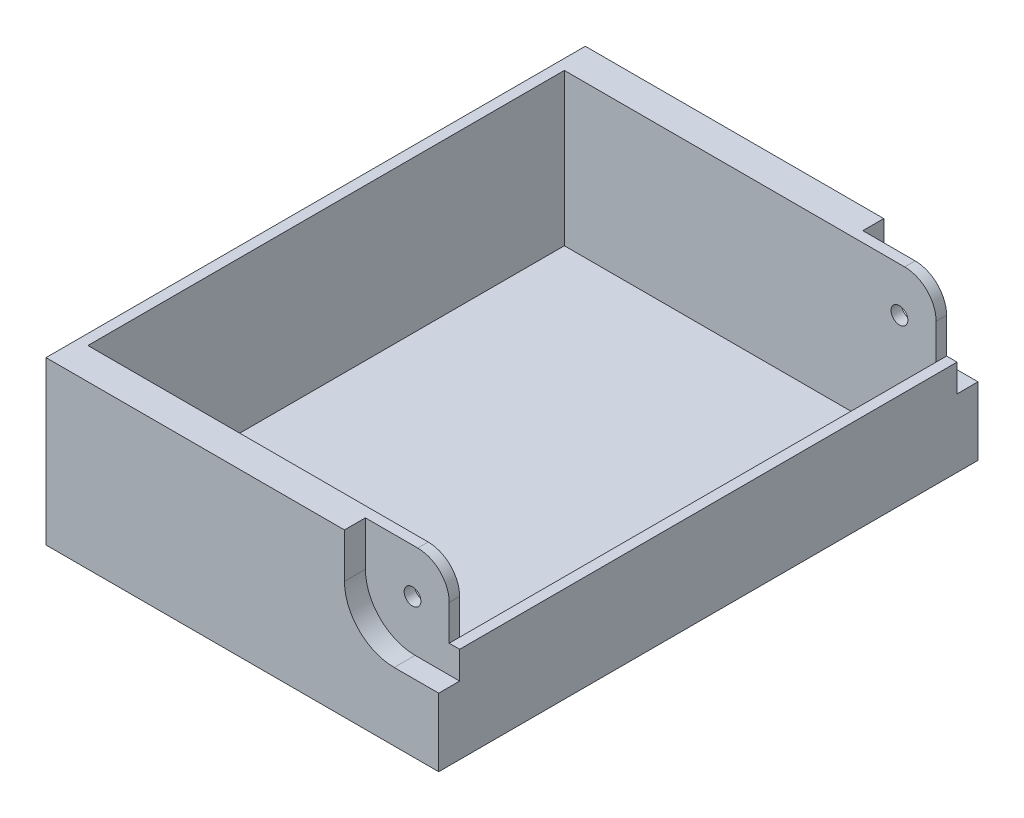
ISO-10303-21;
HEADER;
FILE_DESCRIPTION(('STEP AP214'),'2;1');
FILE_NAME('part.step','',(''),(''),'','','');
FILE_SCHEMA(('AUTOMOTIVE_DESIGN { 1 0 10303 214 1 1 1 1 }'));
ENDSEC;
DATA;
#1=APPLICATION_CONTEXT('core data for automotive mechanical design processes');
#2=APPLICATION_PROTOCOL_DEFINITION('international standard','automotive_design',2000,#1);
#3=PRODUCT_CONTEXT('',#1,'mechanical');
#4=PRODUCT('Part','Part','',(#3));
#5=PRODUCT_RELATED_PRODUCT_CATEGORY('part','',(#4));
#6=PRODUCT_DEFINITION_FORMATION('','',#4);
#7=PRODUCT_DEFINITION_CONTEXT('part definition',#1,'design');
#8=PRODUCT_DEFINITION('design','',#6,#7);
#9=PRODUCT_DEFINITION_SHAPE('','',#8);
#10=(LENGTH_UNIT() NAMED_UNIT(*) SI_UNIT(.MILLI.,.METRE.));
#11=(NAMED_UNIT(*) PLANE_ANGLE_UNIT() SI_UNIT($,.RADIAN.));
#12=(NAMED_UNIT(*) SI_UNIT($,.STERADIAN.) SOLID_ANGLE_UNIT());
#13=UNCERTAINTY_MEASURE_WITH_UNIT(LENGTH_MEASURE(1.E-05),#10,'distance_accuracy_value','');
#14=(GEOMETRIC_REPRESENTATION_CONTEXT(3) GLOBAL_UNCERTAINTY_ASSIGNED_CONTEXT((#13)) GLOBAL_UNIT_ASSIGNED_CONTEXT((#10,
#11,#12)) REPRESENTATION_CONTEXT('',''));
#15=CARTESIAN_POINT('',(0.,0.,0.));
#16=DIRECTION('',(0.,0.,1.));
#17=DIRECTION('',(1.,0.,0.));
#18=AXIS2_PLACEMENT_3D('',#15,#16,#17);
#19=CARTESIAN_POINT('',(-59.1666666666667,25.,51.2002398081536));
#20=DIRECTION('',(0.,0.,-1.));
#21=DIRECTION('',(-1.,0.,0.));
#22=AXIS2_PLACEMENT_3D('',#19,#20,#21);
#23=PLANE('',#22);
#24=CARTESIAN_POINT('',(6.83333333333334,16.5,51.2002398081536));
#25=DIRECTION('',(0.,0.,-1.));
#26=DIRECTION('',(-1.,0.,0.));
#27=AXIS2_PLACEMENT_3D('',#24,#25,#26);
#28=CIRCLE('',#27,1.6);
#29=CARTESIAN_POINT('',(5.23333333333334,16.5,51.2002398081536));
#30=VERTEX_POINT('',#29);
#31=EDGE_CURVE('E323',#30,#30,#28,.T.);
#32=ORIENTED_EDGE('',*,*,#31,.F.);
#33=EDGE_LOOP('',(#32));
#34=FACE_BOUND('',#33,.T.);
#35=CARTESIAN_POINT('',(7.83333333333333,19.,51.2002398081536));
#36=DIRECTION('',(0.,0.,-1.));
#37=DIRECTION('',(-1.,0.,0.));
#38=AXIS2_PLACEMENT_3D('',#35,#36,#37);
#39=CIRCLE('',#38,6.);
#40=CARTESIAN_POINT('',(13.8333333333333,19.,51.2002398081536));
#41=VERTEX_POINT('',#40);
#42=CARTESIAN_POINT('',(7.83333333333329,25.,51.2002398081536));
#43=VERTEX_POINT('',#42);
#44=EDGE_CURVE('E250',#41,#43,#39,.F.);
#45=ORIENTED_EDGE('',*,*,#44,.F.);
#46=DIRECTION('',(0.,-1.,0.));
#47=VECTOR('',#46,1.);
#48=CARTESIAN_POINT('',(13.8333333333333,25.,51.2002398081536));
#49=LINE('',#48,#47);
#50=CARTESIAN_POINT('',(13.8333333333333,12.2573593128807,51.2002398081536));
#51=VERTEX_POINT('',#50);
#52=EDGE_CURVE('E196',#41,#51,#49,.T.);
#53=ORIENTED_EDGE('',*,*,#52,.T.);
#54=CARTESIAN_POINT('',(13.8333333333333,-4.,51.2002398081536));
#55=VERTEX_POINT('',#54);
#56=EDGE_CURVE('E202',#51,#55,#49,.T.);
#57=ORIENTED_EDGE('',*,*,#56,.T.);
#58=DIRECTION('',(1.,0.,0.));
#59=VECTOR('',#58,1.);
#60=CARTESIAN_POINT('',(-57.1666666666667,-4.,51.2002398081536));
#61=LINE('',#60,#59);
#62=CARTESIAN_POINT('',(-57.1666666666667,-4.,51.2002398081536));
#63=VERTEX_POINT('',#62);
#64=EDGE_CURVE('E199',#63,#55,#61,.T.);
#65=ORIENTED_EDGE('',*,*,#64,.F.);
#66=DIRECTION('',(0.,-1.,0.));
#67=VECTOR('',#66,1.);
#68=CARTESIAN_POINT('',(-57.1666666666667,25.,51.2002398081536));
#69=LINE('',#68,#67);
#70=CARTESIAN_POINT('',(-57.1666666666667,25.,51.2002398081536));
#71=VERTEX_POINT('',#70);
#72=EDGE_CURVE('E182',#71,#63,#69,.T.);
#73=ORIENTED_EDGE('',*,*,#72,.F.);
#74=DIRECTION('',(1.,0.,0.));
#75=VECTOR('',#74,1.);
#76=CARTESIAN_POINT('',(-59.1666666666667,25.,51.2002398081536));
#77=LINE('',#76,#75);
#78=EDGE_CURVE('E396',#71,#43,#77,.T.);
#79=ORIENTED_EDGE('',*,*,#78,.T.);
#80=EDGE_LOOP('',(#45,#53,#57,#65,#73,#79));
#81=FACE_BOUND('',#80,.T.);
#82=ADVANCED_FACE('F39',(#34,#81),#23,.T.);
#83=CARTESIAN_POINT('',(-59.1666666666667,25.,-39.7997601918464));
#84=DIRECTION('',(0.,0.,1.));
#85=DIRECTION('',(1.,0.,0.));
#86=AXIS2_PLACEMENT_3D('',#83,#84,#85);
#87=PLANE('',#86);
#88=CARTESIAN_POINT('',(6.83333333333334,16.5,-39.7997601918464));
#89=DIRECTION('',(0.,0.,1.));
#90=DIRECTION('',(1.,0.,0.));
#91=AXIS2_PLACEMENT_3D('',#88,#89,#90);
#92=CIRCLE('',#91,1.6);
#93=CARTESIAN_POINT('',(8.43333333333334,16.5,-39.7997601918464));
#94=VERTEX_POINT('',#93);
#95=EDGE_CURVE('E319',#94,#94,#92,.T.);
#96=ORIENTED_EDGE('',*,*,#95,.F.);
#97=EDGE_LOOP('',(#96));
#98=FACE_BOUND('',#97,.T.);
#99=CARTESIAN_POINT('',(7.83333333333333,19.,-39.7997601918464));
#100=DIRECTION('',(0.,0.,1.));
#101=DIRECTION('',(1.,0.,0.));
#102=AXIS2_PLACEMENT_3D('',#99,#100,#101);
#103=CIRCLE('',#102,6.);
#104=CARTESIAN_POINT('',(7.83333333333329,25.,-39.7997601918464));
#105=VERTEX_POINT('',#104);
#106=CARTESIAN_POINT('',(13.8333333333333,19.,-39.7997601918464));
#107=VERTEX_POINT('',#106);
#108=EDGE_CURVE('E63',#105,#107,#103,.F.);
#109=ORIENTED_EDGE('',*,*,#108,.F.);
#110=DIRECTION('',(-1.,0.,0.));
#111=VECTOR('',#110,1.);
#112=CARTESIAN_POINT('',(-59.1666666666667,25.,-39.7997601918464));
#113=LINE('',#112,#111);
#114=CARTESIAN_POINT('',(-57.1666666666667,25.,-39.7997601918464));
#115=VERTEX_POINT('',#114);
#116=EDGE_CURVE('E388',#105,#115,#113,.T.);
#117=ORIENTED_EDGE('',*,*,#116,.T.);
#118=DIRECTION('',(0.,-1.,0.));
#119=VECTOR('',#118,1.);
#120=CARTESIAN_POINT('',(-57.1666666666667,25.,-39.7997601918464));
#121=LINE('',#120,#119);
#122=CARTESIAN_POINT('',(-57.1666666666667,-4.,-39.7997601918464));
#123=VERTEX_POINT('',#122);
#124=EDGE_CURVE('E384',#115,#123,#121,.T.);
#125=ORIENTED_EDGE('',*,*,#124,.T.);
#126=DIRECTION('',(-1.,0.,0.));
#127=VECTOR('',#126,1.);
#128=CARTESIAN_POINT('',(-57.1666666666667,-4.,-39.7997601918464));
#129=LINE('',#128,#127);
#130=CARTESIAN_POINT('',(13.8333333333333,-4.,-39.7997601918464));
#131=VERTEX_POINT('',#130);
#132=EDGE_CURVE('E211',#131,#123,#129,.T.);
#133=ORIENTED_EDGE('',*,*,#132,.F.);
#134=DIRECTION('',(0.,-1.,0.));
#135=VECTOR('',#134,1.);
#136=CARTESIAN_POINT('',(13.8333333333333,25.,-39.7997601918464));
#137=LINE('',#136,#135);
#138=CARTESIAN_POINT('',(13.8333333333333,12.2573593128807,-39.7997601918464));
#139=VERTEX_POINT('',#138);
#140=EDGE_CURVE('E387',#139,#131,#137,.T.);
#141=ORIENTED_EDGE('',*,*,#140,.F.);
#142=EDGE_CURVE('E391',#107,#139,#137,.T.);
#143=ORIENTED_EDGE('',*,*,#142,.F.);
#144=EDGE_LOOP('',(#109,#117,#125,#133,#141,#143));
#145=FACE_BOUND('',#144,.T.);
#146=ADVANCED_FACE('F461',(#98,#145),#87,.T.);
#147=CARTESIAN_POINT('',(7.33333333333333,16.5,-41.7997601918464));
#148=DIRECTION('',(0.,0.,-1.));
#149=DIRECTION('',(-1.,0.,0.));
#150=AXIS2_PLACEMENT_3D('',#147,#148,#149);
#151=PLANE('',#150);
#152=CARTESIAN_POINT('',(6.83333333333334,16.5,-41.7997601918464));
#153=DIRECTION('',(0.,0.,-1.));
#154=DIRECTION('',(-1.,0.,0.));
#155=AXIS2_PLACEMENT_3D('',#152,#153,#154);
#156=CIRCLE('',#155,1.6);
#157=CARTESIAN_POINT('',(5.23333333333334,16.5,-41.7997601918464));
#158=VERTEX_POINT('',#157);
#159=EDGE_CURVE('E315',#158,#158,#156,.T.);
#160=ORIENTED_EDGE('',*,*,#159,.F.);
#161=EDGE_LOOP('',(#160));
#162=FACE_BOUND('',#161,.T.);
#163=CARTESIAN_POINT('',(7.83333333333333,19.,-41.7997601918464));
#164=DIRECTION('',(0.,0.,-1.));
#165=DIRECTION('',(-1.,0.,0.));
#166=AXIS2_PLACEMENT_3D('',#163,#164,#165);
#167=CIRCLE('',#166,6.);
#168=CARTESIAN_POINT('',(13.8333333333333,19.,-41.7997601918464));
#169=VERTEX_POINT('',#168);
#170=CARTESIAN_POINT('',(7.83333333333329,25.,-41.7997601918464));
#171=VERTEX_POINT('',#170);
#172=EDGE_CURVE('E235',#169,#171,#167,.F.);
#173=ORIENTED_EDGE('',*,*,#172,.F.);
#174=DIRECTION('',(0.,1.,0.));
#175=VECTOR('',#174,1.);
#176=CARTESIAN_POINT('',(13.8333333333333,25.,-41.7997601918464));
#177=LINE('',#176,#175);
#178=CARTESIAN_POINT('',(13.8333333333333,12.2573593128807,-41.7997601918464));
#179=VERTEX_POINT('',#178);
#180=EDGE_CURVE('E295',#179,#169,#177,.T.);
#181=ORIENTED_EDGE('',*,*,#180,.F.);
#182=DIRECTION('',(1.,0.,0.));
#183=VECTOR('',#182,1.);
#184=CARTESIAN_POINT('',(13.8333333333333,12.2573593128807,-41.7997601918464));
#185=LINE('',#184,#183);
#186=CARTESIAN_POINT('',(15.8333333333333,12.2573593128807,-41.7997601918464));
#187=VERTEX_POINT('',#186);
#188=EDGE_CURVE('E304',#179,#187,#185,.T.);
#189=ORIENTED_EDGE('',*,*,#188,.T.);
#190=DIRECTION('',(0.,-1.,0.));
#191=VECTOR('',#190,1.);
#192=CARTESIAN_POINT('',(15.8333333333333,7.,-41.7997601918464));
#193=LINE('',#192,#191);
#194=CARTESIAN_POINT('',(15.8333333333333,7.,-41.7997601918464));
#195=VERTEX_POINT('',#194);
#196=EDGE_CURVE('E271',#187,#195,#193,.T.);
#197=ORIENTED_EDGE('',*,*,#196,.T.);
#198=DIRECTION('',(-1.,0.,0.));
#199=VECTOR('',#198,1.);
#200=CARTESIAN_POINT('',(7.33333333333323,7.,-41.7997601918464));
#201=LINE('',#200,#199);
#202=CARTESIAN_POINT('',(7.33333333333333,7.,-41.7997601918464));
#203=VERTEX_POINT('',#202);
#204=EDGE_CURVE('E274',#195,#203,#201,.T.);
#205=ORIENTED_EDGE('',*,*,#204,.T.);
#206=CARTESIAN_POINT('',(7.33333333333333,16.5,-41.7997601918464));
#207=DIRECTION('',(0.,0.,-1.));
#208=DIRECTION('',(-1.,0.,0.));
#209=AXIS2_PLACEMENT_3D('',#206,#207,#208);
#210=CIRCLE('',#209,9.5);
#211=CARTESIAN_POINT('',(-2.16666666666667,16.5,-41.7997601918464));
#212=VERTEX_POINT('',#211);
#213=EDGE_CURVE('E346',#203,#212,#210,.T.);
#214=ORIENTED_EDGE('',*,*,#213,.T.);
#215=DIRECTION('',(0.,1.,0.));
#216=VECTOR('',#215,1.);
#217=CARTESIAN_POINT('',(-2.16666666666668,26.,-41.7997601918464));
#218=LINE('',#217,#216);
#219=CARTESIAN_POINT('',(-2.16666666666668,25.,-41.7997601918464));
#220=VERTEX_POINT('',#219);
#221=EDGE_CURVE('E349',#212,#220,#218,.T.);
#222=ORIENTED_EDGE('',*,*,#221,.T.);
#223=DIRECTION('',(-1.,0.,0.));
#224=VECTOR('',#223,1.);
#225=CARTESIAN_POINT('',(0.,25.,-41.7997601918464));
#226=LINE('',#225,#224);
#227=EDGE_CURVE('E407',#171,#220,#226,.T.);
#228=ORIENTED_EDGE('',*,*,#227,.F.);
#229=EDGE_LOOP('',(#173,#181,#189,#197,#205,#214,#222,#228));
#230=FACE_BOUND('',#229,.T.);
#231=ADVANCED_FACE('F447',(#162,#230),#151,.T.);
#232=CARTESIAN_POINT('',(7.33333333333334,16.5,53.2002398081536));
#233=DIRECTION('',(0.,0.,1.));
#234=DIRECTION('',(1.,0.,0.));
#235=AXIS2_PLACEMENT_3D('',#232,#233,#234);
#236=PLANE('',#235);
#237=CARTESIAN_POINT('',(6.83333333333334,16.5,53.2002398081536));
#238=DIRECTION('',(0.,0.,1.));
#239=DIRECTION('',(1.,0.,0.));
#240=AXIS2_PLACEMENT_3D('',#237,#238,#239);
#241=CIRCLE('',#240,1.6);
#242=CARTESIAN_POINT('',(8.43333333333334,16.5,53.2002398081536));
#243=VERTEX_POINT('',#242);
#244=EDGE_CURVE('E308',#243,#243,#241,.T.);
#245=ORIENTED_EDGE('',*,*,#244,.F.);
#246=EDGE_LOOP('',(#245));
#247=FACE_BOUND('',#246,.T.);
#248=CARTESIAN_POINT('',(7.83333333333333,19.,53.2002398081536));
#249=DIRECTION('',(0.,0.,1.));
#250=DIRECTION('',(1.,0.,0.));
#251=AXIS2_PLACEMENT_3D('',#248,#249,#250);
#252=CIRCLE('',#251,6.);
#253=CARTESIAN_POINT('',(7.83333333333329,25.,53.2002398081536));
#254=VERTEX_POINT('',#253);
#255=CARTESIAN_POINT('',(13.8333333333333,19.,53.2002398081536));
#256=VERTEX_POINT('',#255);
#257=EDGE_CURVE('E55',#254,#256,#252,.F.);
#258=ORIENTED_EDGE('',*,*,#257,.F.);
#259=DIRECTION('',(1.,0.,0.));
#260=VECTOR('',#259,1.);
#261=CARTESIAN_POINT('',(0.,25.,53.2002398081536));
#262=LINE('',#261,#260);
#263=CARTESIAN_POINT('',(-2.16666666666666,25.,53.2002398081536));
#264=VERTEX_POINT('',#263);
#265=EDGE_CURVE('E48',#264,#254,#262,.T.);
#266=ORIENTED_EDGE('',*,*,#265,.F.);
#267=DIRECTION('',(0.,-1.,0.));
#268=VECTOR('',#267,1.);
#269=CARTESIAN_POINT('',(-2.16666666666666,26.,53.2002398081536));
#270=LINE('',#269,#268);
#271=CARTESIAN_POINT('',(-2.16666666666666,16.5,53.2002398081536));
#272=VERTEX_POINT('',#271);
#273=EDGE_CURVE('E328',#264,#272,#270,.T.);
#274=ORIENTED_EDGE('',*,*,#273,.T.);
#275=CARTESIAN_POINT('',(7.33333333333334,16.5,53.2002398081536));
#276=DIRECTION('',(0.,0.,1.));
#277=DIRECTION('',(1.,0.,0.));
#278=AXIS2_PLACEMENT_3D('',#275,#276,#277);
#279=CIRCLE('',#278,9.5);
#280=CARTESIAN_POINT('',(7.33333333333344,7.,53.2002398081536));
#281=VERTEX_POINT('',#280);
#282=EDGE_CURVE('E331',#272,#281,#279,.T.);
#283=ORIENTED_EDGE('',*,*,#282,.T.);
#284=DIRECTION('',(1.,0.,0.));
#285=VECTOR('',#284,1.);
#286=CARTESIAN_POINT('',(7.33333333333344,7.,53.2002398081536));
#287=LINE('',#286,#285);
#288=CARTESIAN_POINT('',(15.8333333333333,7.,53.2002398081536));
#289=VERTEX_POINT('',#288);
#290=EDGE_CURVE('E254',#281,#289,#287,.T.);
#291=ORIENTED_EDGE('',*,*,#290,.T.);
#292=DIRECTION('',(0.,1.,0.));
#293=VECTOR('',#292,1.);
#294=CARTESIAN_POINT('',(15.8333333333333,7.,53.2002398081536));
#295=LINE('',#294,#293);
#296=CARTESIAN_POINT('',(15.8333333333333,12.2573593128807,53.2002398081536));
#297=VERTEX_POINT('',#296);
#298=EDGE_CURVE('E258',#289,#297,#295,.T.);
#299=ORIENTED_EDGE('',*,*,#298,.T.);
#300=DIRECTION('',(1.,0.,0.));
#301=VECTOR('',#300,1.);
#302=CARTESIAN_POINT('',(13.8333333333333,12.2573593128807,53.2002398081536));
#303=LINE('',#302,#301);
#304=CARTESIAN_POINT('',(13.8333333333333,12.2573593128807,53.2002398081536));
#305=VERTEX_POINT('',#304);
#306=EDGE_CURVE('E300',#305,#297,#303,.T.);
#307=ORIENTED_EDGE('',*,*,#306,.F.);
#308=DIRECTION('',(0.,-1.,0.));
#309=VECTOR('',#308,1.);
#310=CARTESIAN_POINT('',(13.8333333333333,25.,53.2002398081536));
#311=LINE('',#310,#309);
#312=EDGE_CURVE('E287',#256,#305,#311,.T.);
#313=ORIENTED_EDGE('',*,*,#312,.F.);
#314=EDGE_LOOP('',(#258,#266,#274,#283,#291,#299,#307,#313));
#315=FACE_BOUND('',#314,.T.);
#316=ADVANCED_FACE('F422',(#247,#315),#236,.T.);
#317=CARTESIAN_POINT('',(13.8333333333333,0.,0.));
#318=DIRECTION('',(1.,0.,0.));
#319=DIRECTION('',(0.,0.,-1.));
#320=AXIS2_PLACEMENT_3D('',#317,#318,#319);
#321=PLANE('',#320);
#322=ORIENTED_EDGE('',*,*,#52,.F.);
#323=DIRECTION('',(0.,0.,-1.));
#324=VECTOR('',#323,1.);
#325=CARTESIAN_POINT('',(13.8333333333333,19.,108.200239808154));
#326=LINE('',#325,#324);
#327=EDGE_CURVE('E238',#256,#41,#326,.T.);
#328=ORIENTED_EDGE('',*,*,#327,.F.);
#329=ORIENTED_EDGE('',*,*,#312,.T.);
#330=DIRECTION('',(0.,0.,-1.));
#331=VECTOR('',#330,1.);
#332=CARTESIAN_POINT('',(13.8333333333333,12.2573593128807,53.2002398081536));
#333=LINE('',#332,#331);
#334=EDGE_CURVE('E291',#305,#51,#333,.T.);
#335=ORIENTED_EDGE('',*,*,#334,.T.);
#336=EDGE_LOOP('',(#322,#328,#329,#335));
#337=FACE_BOUND('',#336,.T.);
#338=ADVANCED_FACE('F467',(#337),#321,.T.);
#339=ORIENTED_EDGE('',*,*,#180,.T.);
#340=DIRECTION('',(0.,0.,-1.));
#341=VECTOR('',#340,1.);
#342=CARTESIAN_POINT('',(13.8333333333333,19.,108.200239808154));
#343=LINE('',#342,#341);
#344=EDGE_CURVE('E11',#169,#107,#343,.F.);
#345=ORIENTED_EDGE('',*,*,#344,.T.);
#346=ORIENTED_EDGE('',*,*,#142,.T.);
#347=EDGE_CURVE('E290',#139,#179,#333,.T.);
#348=ORIENTED_EDGE('',*,*,#347,.T.);
#349=EDGE_LOOP('',(#339,#345,#346,#348));
#350=FACE_BOUND('',#349,.T.);
#351=ADVANCED_FACE('F451',(#350),#321,.T.);
#352=CARTESIAN_POINT('',(7.33333333333333,16.5,-41.7997601918464));
#353=DIRECTION('',(0.,0.,-1.));
#354=DIRECTION('',(-1.,0.,0.));
#355=AXIS2_PLACEMENT_3D('',#352,#353,#354);
#356=CYLINDRICAL_SURFACE('',#355,9.5);
#357=DIRECTION('',(0.,0.,-1.));
#358=VECTOR('',#357,1.);
#359=CARTESIAN_POINT('',(7.33333333333323,7.,-41.7997601918464));
#360=LINE('',#359,#358);
#361=CARTESIAN_POINT('',(7.33333333333323,7.,-45.7997601918464));
#362=VERTEX_POINT('',#361);
#363=EDGE_CURVE('E280',#203,#362,#360,.T.);
#364=ORIENTED_EDGE('',*,*,#363,.T.);
#365=CARTESIAN_POINT('',(7.33333333333333,16.5,-45.7997601918464));
#366=DIRECTION('',(0.,0.,-1.));
#367=DIRECTION('',(-1.,0.,0.));
#368=AXIS2_PLACEMENT_3D('',#365,#366,#367);
#369=CIRCLE('',#368,9.5);
#370=CARTESIAN_POINT('',(-2.16666666666667,16.5,-45.7997601918464));
#371=VERTEX_POINT('',#370);
#372=EDGE_CURVE('E404',#362,#371,#369,.T.);
#373=ORIENTED_EDGE('',*,*,#372,.T.);
#374=DIRECTION('',(0.,0.,-1.));
#375=VECTOR('',#374,1.);
#376=CARTESIAN_POINT('',(-2.16666666666667,16.5,-41.7997601918464));
#377=LINE('',#376,#375);
#378=EDGE_CURVE('E353',#212,#371,#377,.T.);
#379=ORIENTED_EDGE('',*,*,#378,.F.);
#380=ORIENTED_EDGE('',*,*,#213,.F.);
#381=EDGE_LOOP('',(#364,#373,#379,#380));
#382=FACE_BOUND('',#381,.T.);
#383=ADVANCED_FACE('F497',(#382),#356,.F.);
#384=CARTESIAN_POINT('',(0.,25.,0.));
#385=DIRECTION('',(0.,1.,0.));
#386=DIRECTION('',(0.,0.,1.));
#387=AXIS2_PLACEMENT_3D('',#384,#385,#386);
#388=PLANE('',#387);
#389=DIRECTION('',(0.,0.,-1.));
#390=VECTOR('',#389,1.);
#391=CARTESIAN_POINT('',(7.83333333333329,25.,108.200239808154));
#392=LINE('',#391,#390);
#393=EDGE_CURVE('E239',#105,#171,#392,.T.);
#394=ORIENTED_EDGE('',*,*,#393,.T.);
#395=ORIENTED_EDGE('',*,*,#227,.T.);
#396=DIRECTION('',(0.,0.,1.));
#397=VECTOR('',#396,1.);
#398=CARTESIAN_POINT('',(-2.16666666666668,25.,0.));
#399=LINE('',#398,#397);
#400=CARTESIAN_POINT('',(-2.16666666666668,25.,-45.7997601918464));
#401=VERTEX_POINT('',#400);
#402=EDGE_CURVE('E359',#401,#220,#399,.T.);
#403=ORIENTED_EDGE('',*,*,#402,.F.);
#404=DIRECTION('',(1.,0.,0.));
#405=VECTOR('',#404,1.);
#406=CARTESIAN_POINT('',(15.8333333333333,25.,-45.7997601918464));
#407=LINE('',#406,#405);
#408=CARTESIAN_POINT('',(-59.1666666666667,25.,-45.7997601918464));
#409=VERTEX_POINT('',#408);
#410=EDGE_CURVE('E370',#409,#401,#407,.T.);
#411=ORIENTED_EDGE('',*,*,#410,.F.);
#412=DIRECTION('',(0.,0.,1.));
#413=VECTOR('',#412,1.);
#414=CARTESIAN_POINT('',(-59.1666666666667,25.,-41.7997601918464));
#415=LINE('',#414,#413);
#416=CARTESIAN_POINT('',(-59.1666666666667,25.,57.2002398081536));
#417=VERTEX_POINT('',#416);
#418=EDGE_CURVE('E195',#409,#417,#415,.T.);
#419=ORIENTED_EDGE('',*,*,#418,.T.);
#420=DIRECTION('',(-1.,0.,0.));
#421=VECTOR('',#420,1.);
#422=CARTESIAN_POINT('',(-59.1666666666667,25.,57.2002398081536));
#423=LINE('',#422,#421);
#424=CARTESIAN_POINT('',(-2.16666666666666,25.,57.2002398081536));
#425=VERTEX_POINT('',#424);
#426=EDGE_CURVE('E381',#425,#417,#423,.T.);
#427=ORIENTED_EDGE('',*,*,#426,.F.);
#428=DIRECTION('',(0.,0.,1.));
#429=VECTOR('',#428,1.);
#430=CARTESIAN_POINT('',(-2.16666666666666,25.,0.));
#431=LINE('',#430,#429);
#432=EDGE_CURVE('E342',#264,#425,#431,.T.);
#433=ORIENTED_EDGE('',*,*,#432,.F.);
#434=ORIENTED_EDGE('',*,*,#265,.T.);
#435=EDGE_CURVE('E243',#254,#43,#392,.T.);
#436=ORIENTED_EDGE('',*,*,#435,.T.);
#437=ORIENTED_EDGE('',*,*,#78,.F.);
#438=DIRECTION('',(0.,0.,1.));
#439=VECTOR('',#438,1.);
#440=CARTESIAN_POINT('',(-57.1666666666667,25.,-41.7997601918464));
#441=LINE('',#440,#439);
#442=EDGE_CURVE('E190',#115,#71,#441,.T.);
#443=ORIENTED_EDGE('',*,*,#442,.F.);
#444=ORIENTED_EDGE('',*,*,#116,.F.);
#445=EDGE_LOOP('',(#394,#395,#403,#411,#419,#427,#433,#434,#436,#437,#443,#444));
#446=FACE_BOUND('',#445,.T.);
#447=ADVANCED_FACE('F418',(#446),#388,.T.);
#448=CARTESIAN_POINT('',(-59.1666666666667,25.,-41.7997601918464));
#449=DIRECTION('',(1.,0.,0.));
#450=DIRECTION('',(0.,0.,-1.));
#451=AXIS2_PLACEMENT_3D('',#448,#449,#450);
#452=PLANE('',#451);
#453=DIRECTION('',(0.,1.,0.));
#454=VECTOR('',#453,1.);
#455=CARTESIAN_POINT('',(-59.1666666666667,25.,-45.7997601918464));
#456=LINE('',#455,#454);
#457=CARTESIAN_POINT('',(-59.1666666666667,-6.,-45.7997601918464));
#458=VERTEX_POINT('',#457);
#459=EDGE_CURVE('E366',#458,#409,#456,.T.);
#460=ORIENTED_EDGE('',*,*,#459,.F.);
#461=DIRECTION('',(0.,0.,-1.));
#462=VECTOR('',#461,1.);
#463=CARTESIAN_POINT('',(-59.1666666666667,-6.,57.2002398081536));
#464=LINE('',#463,#462);
#465=CARTESIAN_POINT('',(-59.1666666666667,-6.,57.2002398081536));
#466=VERTEX_POINT('',#465);
#467=EDGE_CURVE('E219',#466,#458,#464,.T.);
#468=ORIENTED_EDGE('',*,*,#467,.F.);
#469=DIRECTION('',(0.,-1.,0.));
#470=VECTOR('',#469,1.);
#471=CARTESIAN_POINT('',(-59.1666666666667,0.,57.2002398081536));
#472=LINE('',#471,#470);
#473=EDGE_CURVE('E374',#417,#466,#472,.T.);
#474=ORIENTED_EDGE('',*,*,#473,.F.);
#475=ORIENTED_EDGE('',*,*,#418,.F.);
#476=EDGE_LOOP('',(#460,#468,#474,#475));
#477=FACE_BOUND('',#476,.T.);
#478=ADVANCED_FACE('F41',(#477),#452,.F.);
#479=CARTESIAN_POINT('',(15.8333333333333,25.,-41.7997601918464));
#480=DIRECTION('',(-1.,0.,0.));
#481=DIRECTION('',(0.,0.,1.));
#482=AXIS2_PLACEMENT_3D('',#479,#480,#481);
#483=PLANE('',#482);
#484=ORIENTED_EDGE('',*,*,#298,.F.);
#485=DIRECTION('',(0.,0.,1.));
#486=VECTOR('',#485,1.);
#487=CARTESIAN_POINT('',(15.8333333333333,7.,53.2002398081536));
#488=LINE('',#487,#486);
#489=CARTESIAN_POINT('',(15.8333333333333,7.,57.2002398081536));
#490=VERTEX_POINT('',#489);
#491=EDGE_CURVE('E264',#289,#490,#488,.T.);
#492=ORIENTED_EDGE('',*,*,#491,.T.);
#493=DIRECTION('',(0.,1.,0.));
#494=VECTOR('',#493,1.);
#495=CARTESIAN_POINT('',(15.8333333333333,0.,57.2002398081536));
#496=LINE('',#495,#494);
#497=CARTESIAN_POINT('',(15.8333333333333,-6.,57.2002398081536));
#498=VERTEX_POINT('',#497);
#499=EDGE_CURVE('E377',#498,#490,#496,.T.);
#500=ORIENTED_EDGE('',*,*,#499,.F.);
#501=DIRECTION('',(0.,0.,1.));
#502=VECTOR('',#501,1.);
#503=CARTESIAN_POINT('',(15.8333333333333,-6.,57.2002398081536));
#504=LINE('',#503,#502);
#505=CARTESIAN_POINT('',(15.8333333333333,-6.,-45.7997601918464));
#506=VERTEX_POINT('',#505);
#507=EDGE_CURVE('E227',#506,#498,#504,.T.);
#508=ORIENTED_EDGE('',*,*,#507,.F.);
#509=DIRECTION('',(0.,-1.,0.));
#510=VECTOR('',#509,1.);
#511=CARTESIAN_POINT('',(15.8333333333333,25.,-45.7997601918464));
#512=LINE('',#511,#510);
#513=CARTESIAN_POINT('',(15.8333333333333,7.,-45.7997601918464));
#514=VERTEX_POINT('',#513);
#515=EDGE_CURVE('E363',#514,#506,#512,.T.);
#516=ORIENTED_EDGE('',*,*,#515,.F.);
#517=DIRECTION('',(0.,0.,-1.));
#518=VECTOR('',#517,1.);
#519=CARTESIAN_POINT('',(15.8333333333333,7.,-41.7997601918464));
#520=LINE('',#519,#518);
#521=EDGE_CURVE('E277',#195,#514,#520,.T.);
#522=ORIENTED_EDGE('',*,*,#521,.F.);
#523=ORIENTED_EDGE('',*,*,#196,.F.);
#524=DIRECTION('',(0.,0.,-1.));
#525=VECTOR('',#524,1.);
#526=CARTESIAN_POINT('',(15.8333333333333,12.2573593128807,53.2002398081536));
#527=LINE('',#526,#525);
#528=EDGE_CURVE('E284',#297,#187,#527,.T.);
#529=ORIENTED_EDGE('',*,*,#528,.F.);
#530=EDGE_LOOP('',(#484,#492,#500,#508,#516,#522,#523,#529));
#531=FACE_BOUND('',#530,.T.);
#532=ADVANCED_FACE('F437',(#531),#483,.F.);
#533=CARTESIAN_POINT('',(-57.1666666666667,25.,-41.7997601918464));
#534=DIRECTION('',(1.,0.,0.));
#535=DIRECTION('',(0.,0.,-1.));
#536=AXIS2_PLACEMENT_3D('',#533,#534,#535);
#537=PLANE('',#536);
#538=ORIENTED_EDGE('',*,*,#72,.T.);
#539=DIRECTION('',(0.,0.,1.));
#540=VECTOR('',#539,1.);
#541=CARTESIAN_POINT('',(-57.1666666666667,-4.,-39.7997601918464));
#542=LINE('',#541,#540);
#543=EDGE_CURVE('E187',#123,#63,#542,.T.);
#544=ORIENTED_EDGE('',*,*,#543,.F.);
#545=ORIENTED_EDGE('',*,*,#124,.F.);
#546=ORIENTED_EDGE('',*,*,#442,.T.);
#547=EDGE_LOOP('',(#538,#544,#545,#546));
#548=FACE_BOUND('',#547,.T.);
#549=ADVANCED_FACE('F184',(#548),#537,.T.);
#550=CARTESIAN_POINT('',(13.8333333333333,25.,-41.7997601918464));
#551=DIRECTION('',(-1.,0.,0.));
#552=DIRECTION('',(0.,0.,1.));
#553=AXIS2_PLACEMENT_3D('',#550,#551,#552);
#554=PLANE('',#553);
#555=EDGE_CURVE('E296',#51,#139,#333,.T.);
#556=ORIENTED_EDGE('',*,*,#555,.T.);
#557=ORIENTED_EDGE('',*,*,#140,.T.);
#558=DIRECTION('',(0.,0.,-1.));
#559=VECTOR('',#558,1.);
#560=CARTESIAN_POINT('',(13.8333333333333,-4.,-39.7997601918464));
#561=LINE('',#560,#559);
#562=EDGE_CURVE('E207',#55,#131,#561,.T.);
#563=ORIENTED_EDGE('',*,*,#562,.F.);
#564=ORIENTED_EDGE('',*,*,#56,.F.);
#565=EDGE_LOOP('',(#556,#557,#563,#564));
#566=FACE_BOUND('',#565,.T.);
#567=ADVANCED_FACE('F459',(#566),#554,.T.);
#568=CARTESIAN_POINT('',(0.,0.,57.2002398081536));
#569=DIRECTION('',(0.,0.,-1.));
#570=DIRECTION('',(-1.,0.,0.));
#571=AXIS2_PLACEMENT_3D('',#568,#569,#570);
#572=PLANE('',#571);
#573=ORIENTED_EDGE('',*,*,#499,.T.);
#574=DIRECTION('',(1.,0.,0.));
#575=VECTOR('',#574,1.);
#576=CARTESIAN_POINT('',(7.33333333333344,7.,57.2002398081536));
#577=LINE('',#576,#575);
#578=CARTESIAN_POINT('',(7.33333333333344,7.,57.2002398081536));
#579=VERTEX_POINT('',#578);
#580=EDGE_CURVE('E253',#579,#490,#577,.T.);
#581=ORIENTED_EDGE('',*,*,#580,.F.);
#582=CARTESIAN_POINT('',(7.33333333333334,16.5,57.2002398081536));
#583=DIRECTION('',(0.,0.,1.));
#584=DIRECTION('',(1.,0.,0.));
#585=AXIS2_PLACEMENT_3D('',#582,#583,#584);
#586=CIRCLE('',#585,9.5);
#587=CARTESIAN_POINT('',(-2.16666666666666,16.5,57.2002398081536));
#588=VERTEX_POINT('',#587);
#589=EDGE_CURVE('E327',#588,#579,#586,.T.);
#590=ORIENTED_EDGE('',*,*,#589,.F.);
#591=DIRECTION('',(0.,1.,0.));
#592=VECTOR('',#591,1.);
#593=CARTESIAN_POINT('',(-2.16666666666666,0.,57.2002398081536));
#594=LINE('',#593,#592);
#595=EDGE_CURVE('E410',#588,#425,#594,.T.);
#596=ORIENTED_EDGE('',*,*,#595,.T.);
#597=ORIENTED_EDGE('',*,*,#426,.T.);
#598=ORIENTED_EDGE('',*,*,#473,.T.);
#599=DIRECTION('',(-1.,0.,0.));
#600=VECTOR('',#599,1.);
#601=CARTESIAN_POINT('',(-59.1666666666667,-6.,57.2002398081536));
#602=LINE('',#601,#600);
#603=EDGE_CURVE('E231',#498,#466,#602,.T.);
#604=ORIENTED_EDGE('',*,*,#603,.F.);
#605=EDGE_LOOP('',(#573,#581,#590,#596,#597,#598,#604));
#606=FACE_BOUND('',#605,.T.);
#607=ADVANCED_FACE('F494',(#606),#572,.F.);
#608=CARTESIAN_POINT('',(0.,0.,-45.7997601918464));
#609=DIRECTION('',(0.,0.,-1.));
#610=DIRECTION('',(-1.,0.,0.));
#611=AXIS2_PLACEMENT_3D('',#608,#609,#610);
#612=PLANE('',#611);
#613=DIRECTION('',(-1.,0.,0.));
#614=VECTOR('',#613,1.);
#615=CARTESIAN_POINT('',(7.33333333333323,7.,-45.7997601918464));
#616=LINE('',#615,#614);
#617=EDGE_CURVE('E268',#514,#362,#616,.T.);
#618=ORIENTED_EDGE('',*,*,#617,.F.);
#619=ORIENTED_EDGE('',*,*,#515,.T.);
#620=DIRECTION('',(1.,0.,0.));
#621=VECTOR('',#620,1.);
#622=CARTESIAN_POINT('',(-59.1666666666667,-6.,-45.7997601918464));
#623=LINE('',#622,#621);
#624=EDGE_CURVE('E223',#458,#506,#623,.T.);
#625=ORIENTED_EDGE('',*,*,#624,.F.);
#626=ORIENTED_EDGE('',*,*,#459,.T.);
#627=ORIENTED_EDGE('',*,*,#410,.T.);
#628=DIRECTION('',(0.,1.,0.));
#629=VECTOR('',#628,1.);
#630=CARTESIAN_POINT('',(-2.16666666666668,26.,-45.7997601918464));
#631=LINE('',#630,#629);
#632=EDGE_CURVE('E345',#371,#401,#631,.T.);
#633=ORIENTED_EDGE('',*,*,#632,.F.);
#634=ORIENTED_EDGE('',*,*,#372,.F.);
#635=EDGE_LOOP('',(#618,#619,#625,#626,#627,#633,#634));
#636=FACE_BOUND('',#635,.T.);
#637=ADVANCED_FACE('F512',(#636),#612,.T.);
#638=CARTESIAN_POINT('',(-2.16666666666668,26.,-41.7997601918464));
#639=DIRECTION('',(-1.,0.,0.));
#640=DIRECTION('',(0.,-1.,0.));
#641=AXIS2_PLACEMENT_3D('',#638,#639,#640);
#642=PLANE('',#641);
#643=ORIENTED_EDGE('',*,*,#402,.T.);
#644=ORIENTED_EDGE('',*,*,#221,.F.);
#645=ORIENTED_EDGE('',*,*,#378,.T.);
#646=ORIENTED_EDGE('',*,*,#632,.T.);
#647=EDGE_LOOP('',(#643,#644,#645,#646));
#648=FACE_BOUND('',#647,.T.);
#649=ADVANCED_FACE('F522',(#648),#642,.F.);
#650=CARTESIAN_POINT('',(7.33333333333334,16.5,53.2002398081536));
#651=DIRECTION('',(0.,0.,1.));
#652=DIRECTION('',(1.,0.,0.));
#653=AXIS2_PLACEMENT_3D('',#650,#651,#652);
#654=CYLINDRICAL_SURFACE('',#653,9.5);
#655=ORIENTED_EDGE('',*,*,#589,.T.);
#656=DIRECTION('',(0.,0.,1.));
#657=VECTOR('',#656,1.);
#658=CARTESIAN_POINT('',(7.33333333333344,7.,53.2002398081536));
#659=LINE('',#658,#657);
#660=EDGE_CURVE('E261',#281,#579,#659,.T.);
#661=ORIENTED_EDGE('',*,*,#660,.F.);
#662=ORIENTED_EDGE('',*,*,#282,.F.);
#663=DIRECTION('',(0.,0.,1.));
#664=VECTOR('',#663,1.);
#665=CARTESIAN_POINT('',(-2.16666666666666,16.5,53.2002398081536));
#666=LINE('',#665,#664);
#667=EDGE_CURVE('E335',#272,#588,#666,.T.);
#668=ORIENTED_EDGE('',*,*,#667,.T.);
#669=EDGE_LOOP('',(#655,#661,#662,#668));
#670=FACE_BOUND('',#669,.T.);
#671=ADVANCED_FACE('F431',(#670),#654,.F.);
#672=CARTESIAN_POINT('',(-2.16666666666666,26.,53.2002398081536));
#673=DIRECTION('',(-1.,0.,0.));
#674=DIRECTION('',(0.,0.,1.));
#675=AXIS2_PLACEMENT_3D('',#672,#673,#674);
#676=PLANE('',#675);
#677=ORIENTED_EDGE('',*,*,#432,.T.);
#678=ORIENTED_EDGE('',*,*,#595,.F.);
#679=ORIENTED_EDGE('',*,*,#667,.F.);
#680=ORIENTED_EDGE('',*,*,#273,.F.);
#681=EDGE_LOOP('',(#677,#678,#679,#680));
#682=FACE_BOUND('',#681,.T.);
#683=ADVANCED_FACE('F426',(#682),#676,.F.);
#684=CARTESIAN_POINT('',(6.83333333333334,16.5,-96.7997601918464));
#685=DIRECTION('',(0.,0.,1.));
#686=DIRECTION('',(1.,0.,0.));
#687=AXIS2_PLACEMENT_3D('',#684,#685,#686);
#688=CYLINDRICAL_SURFACE('',#687,1.6);
#689=ORIENTED_EDGE('',*,*,#31,.T.);
#690=EDGE_LOOP('',(#689));
#691=FACE_BOUND('',#690,.T.);
#692=ORIENTED_EDGE('',*,*,#244,.T.);
#693=EDGE_LOOP('',(#692));
#694=FACE_BOUND('',#693,.T.);
#695=ADVANCED_FACE('F544',(#691,#694),#688,.F.);
#696=ORIENTED_EDGE('',*,*,#95,.T.);
#697=EDGE_LOOP('',(#696));
#698=FACE_BOUND('',#697,.T.);
#699=ORIENTED_EDGE('',*,*,#159,.T.);
#700=EDGE_LOOP('',(#699));
#701=FACE_BOUND('',#700,.T.);
#702=ADVANCED_FACE('F537',(#698,#701),#688,.F.);
#703=CARTESIAN_POINT('',(13.8333333333333,12.2573593128807,53.2002398081536));
#704=DIRECTION('',(0.,-1.,0.));
#705=DIRECTION('',(0.,0.,-1.));
#706=AXIS2_PLACEMENT_3D('',#703,#704,#705);
#707=PLANE('',#706);
#708=ORIENTED_EDGE('',*,*,#528,.T.);
#709=ORIENTED_EDGE('',*,*,#188,.F.);
#710=ORIENTED_EDGE('',*,*,#347,.F.);
#711=ORIENTED_EDGE('',*,*,#555,.F.);
#712=ORIENTED_EDGE('',*,*,#334,.F.);
#713=ORIENTED_EDGE('',*,*,#306,.T.);
#714=EDGE_LOOP('',(#708,#709,#710,#711,#712,#713));
#715=FACE_BOUND('',#714,.T.);
#716=ADVANCED_FACE('F441',(#715),#707,.F.);
#717=CARTESIAN_POINT('',(7.33333333333323,7.,-41.7997601918464));
#718=DIRECTION('',(0.,-1.,0.));
#719=DIRECTION('',(1.,0.,0.));
#720=AXIS2_PLACEMENT_3D('',#717,#718,#719);
#721=PLANE('',#720);
#722=ORIENTED_EDGE('',*,*,#617,.T.);
#723=ORIENTED_EDGE('',*,*,#363,.F.);
#724=ORIENTED_EDGE('',*,*,#204,.F.);
#725=ORIENTED_EDGE('',*,*,#521,.T.);
#726=EDGE_LOOP('',(#722,#723,#724,#725));
#727=FACE_BOUND('',#726,.T.);
#728=ADVANCED_FACE('F529',(#727),#721,.F.);
#729=CARTESIAN_POINT('',(7.33333333333344,7.,53.2002398081536));
#730=DIRECTION('',(0.,-1.,0.));
#731=DIRECTION('',(0.,0.,-1.));
#732=AXIS2_PLACEMENT_3D('',#729,#730,#731);
#733=PLANE('',#732);
#734=ORIENTED_EDGE('',*,*,#580,.T.);
#735=ORIENTED_EDGE('',*,*,#491,.F.);
#736=ORIENTED_EDGE('',*,*,#290,.F.);
#737=ORIENTED_EDGE('',*,*,#660,.T.);
#738=EDGE_LOOP('',(#734,#735,#736,#737));
#739=FACE_BOUND('',#738,.T.);
#740=ADVANCED_FACE('F480',(#739),#733,.F.);
#741=CARTESIAN_POINT('',(7.83333333333333,19.,108.200239808154));
#742=DIRECTION('',(0.,0.,-1.));
#743=DIRECTION('',(-1.,0.,0.));
#744=AXIS2_PLACEMENT_3D('',#741,#742,#743);
#745=CYLINDRICAL_SURFACE('',#744,6.);
#746=ORIENTED_EDGE('',*,*,#108,.T.);
#747=ORIENTED_EDGE('',*,*,#344,.F.);
#748=ORIENTED_EDGE('',*,*,#172,.T.);
#749=ORIENTED_EDGE('',*,*,#393,.F.);
#750=EDGE_LOOP('',(#746,#747,#748,#749));
#751=FACE_BOUND('',#750,.T.);
#752=ADVANCED_FACE('F471',(#751),#745,.T.);
#753=ORIENTED_EDGE('',*,*,#44,.T.);
#754=ORIENTED_EDGE('',*,*,#435,.F.);
#755=ORIENTED_EDGE('',*,*,#257,.T.);
#756=ORIENTED_EDGE('',*,*,#327,.T.);
#757=EDGE_LOOP('',(#753,#754,#755,#756));
#758=FACE_BOUND('',#757,.T.);
#759=ADVANCED_FACE('F468',(#758),#745,.T.);
#760=CARTESIAN_POINT('',(0.,-6.,0.));
#761=DIRECTION('',(0.,-1.,0.));
#762=DIRECTION('',(0.,0.,-1.));
#763=AXIS2_PLACEMENT_3D('',#760,#761,#762);
#764=PLANE('',#763);
#765=ORIENTED_EDGE('',*,*,#467,.T.);
#766=ORIENTED_EDGE('',*,*,#624,.T.);
#767=ORIENTED_EDGE('',*,*,#507,.T.);
#768=ORIENTED_EDGE('',*,*,#603,.T.);
#769=EDGE_LOOP('',(#765,#766,#767,#768));
#770=FACE_BOUND('',#769,.T.);
#771=ADVANCED_FACE('F470',(#770),#764,.T.);
#772=CARTESIAN_POINT('',(0.,-4.,0.));
#773=DIRECTION('',(0.,1.,0.));
#774=DIRECTION('',(0.,0.,1.));
#775=AXIS2_PLACEMENT_3D('',#772,#773,#774);
#776=PLANE('',#775);
#777=ORIENTED_EDGE('',*,*,#543,.T.);
#778=ORIENTED_EDGE('',*,*,#64,.T.);
#779=ORIENTED_EDGE('',*,*,#562,.T.);
#780=ORIENTED_EDGE('',*,*,#132,.T.);
#781=EDGE_LOOP('',(#777,#778,#779,#780));
#782=FACE_BOUND('',#781,.T.);
#783=ADVANCED_FACE('F209',(#782),#776,.T.);
#784=CLOSED_SHELL('',(#82,#146,#231,#316,#338,#351,#383,#447,#478,#532,#549,#567,#607,#637,#649,
#671,#683,#695,#702,#716,#728,#740,#752,#759,#771,#783));
#785=MANIFOLD_SOLID_BREP('B2',#784);
#786=ADVANCED_BREP_SHAPE_REPRESENTATION('',(#18,#785),#14);
#787=SHAPE_DEFINITION_REPRESENTATION(#9,#786);
ENDSEC;
END-ISO-10303-21;
